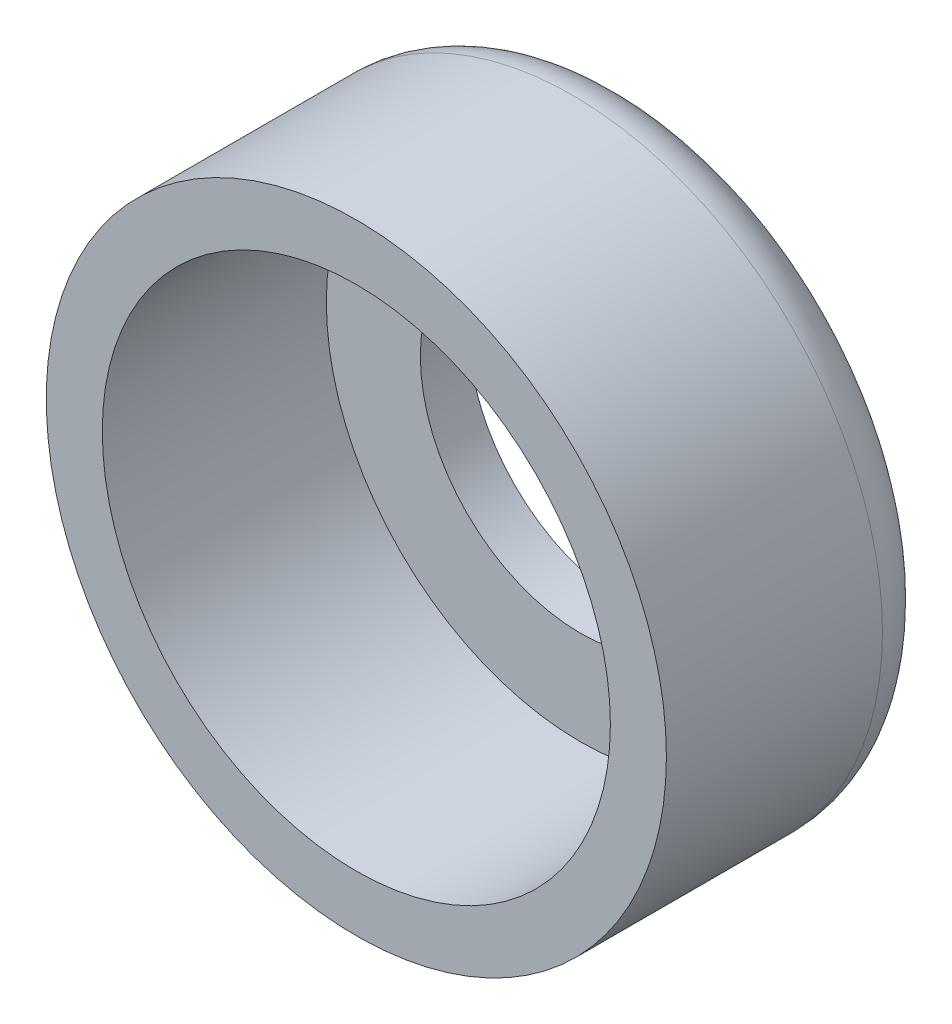
ISO-10303-21;
HEADER;
FILE_DESCRIPTION(('STEP AP214'),'2;1');
FILE_NAME('part.step','',(''),(''),'','','');
FILE_SCHEMA(('AUTOMOTIVE_DESIGN { 1 0 10303 214 1 1 1 1 }'));
ENDSEC;
DATA;
#1=APPLICATION_CONTEXT('core data for automotive mechanical design processes');
#2=APPLICATION_PROTOCOL_DEFINITION('international standard','automotive_design',2000,#1);
#3=PRODUCT_CONTEXT('',#1,'mechanical');
#4=PRODUCT('Part','Part','',(#3));
#5=PRODUCT_RELATED_PRODUCT_CATEGORY('part','',(#4));
#6=PRODUCT_DEFINITION_FORMATION('','',#4);
#7=PRODUCT_DEFINITION_CONTEXT('part definition',#1,'design');
#8=PRODUCT_DEFINITION('design','',#6,#7);
#9=PRODUCT_DEFINITION_SHAPE('','',#8);
#10=(LENGTH_UNIT() NAMED_UNIT(*) SI_UNIT(.MILLI.,.METRE.));
#11=(NAMED_UNIT(*) PLANE_ANGLE_UNIT() SI_UNIT($,.RADIAN.));
#12=(NAMED_UNIT(*) SI_UNIT($,.STERADIAN.) SOLID_ANGLE_UNIT());
#13=UNCERTAINTY_MEASURE_WITH_UNIT(LENGTH_MEASURE(1.E-05),#10,'distance_accuracy_value','');
#14=(GEOMETRIC_REPRESENTATION_CONTEXT(3) GLOBAL_UNCERTAINTY_ASSIGNED_CONTEXT((#13)) GLOBAL_UNIT_ASSIGNED_CONTEXT((#10,
#11,#12)) REPRESENTATION_CONTEXT('',''));
#15=CARTESIAN_POINT('',(0.,0.,0.));
#16=DIRECTION('',(0.,0.,1.));
#17=DIRECTION('',(1.,0.,0.));
#18=AXIS2_PLACEMENT_3D('',#15,#16,#17);
#19=CARTESIAN_POINT('',(0.,0.,0.6));
#20=DIRECTION('',(0.,0.,1.));
#21=DIRECTION('',(1.,0.,0.));
#22=AXIS2_PLACEMENT_3D('',#19,#20,#21);
#23=PLANE('',#22);
#24=CARTESIAN_POINT('',(0.,0.,0.6));
#25=DIRECTION('',(0.,0.,1.));
#26=DIRECTION('',(1.,0.,0.));
#27=AXIS2_PLACEMENT_3D('',#24,#25,#26);
#28=CIRCLE('',#27,2.);
#29=CARTESIAN_POINT('',(2.,0.,0.6));
#30=VERTEX_POINT('',#29);
#31=EDGE_CURVE('E62',#30,#30,#28,.T.);
#32=ORIENTED_EDGE('',*,*,#31,.F.);
#33=EDGE_LOOP('',(#32));
#34=FACE_BOUND('',#33,.T.);
#35=CARTESIAN_POINT('',(0.,0.,0.6));
#36=DIRECTION('',(0.,0.,1.));
#37=DIRECTION('',(1.,0.,0.));
#38=AXIS2_PLACEMENT_3D('',#35,#36,#37);
#39=CIRCLE('',#38,3.175);
#40=CARTESIAN_POINT('',(3.175,0.,0.6));
#41=VERTEX_POINT('',#40);
#42=EDGE_CURVE('E57',#41,#41,#39,.F.);
#43=ORIENTED_EDGE('',*,*,#42,.F.);
#44=EDGE_LOOP('',(#43));
#45=FACE_BOUND('',#44,.T.);
#46=ADVANCED_FACE('F43',(#34,#45),#23,.T.);
#47=CARTESIAN_POINT('',(0.,0.,0.));
#48=DIRECTION('',(0.,0.,1.));
#49=DIRECTION('',(1.,0.,0.));
#50=AXIS2_PLACEMENT_3D('',#47,#48,#49);
#51=PLANE('',#50);
#52=CARTESIAN_POINT('',(0.,0.,0.));
#53=DIRECTION('',(0.,0.,1.));
#54=DIRECTION('',(1.,0.,0.));
#55=AXIS2_PLACEMENT_3D('',#52,#53,#54);
#56=CIRCLE('',#55,3.175);
#57=CARTESIAN_POINT('',(3.175,0.,0.));
#58=VERTEX_POINT('',#57);
#59=EDGE_CURVE('E10',#58,#58,#56,.F.);
#60=ORIENTED_EDGE('',*,*,#59,.T.);
#61=EDGE_LOOP('',(#60));
#62=FACE_BOUND('',#61,.T.);
#63=CARTESIAN_POINT('',(0.,0.,0.));
#64=DIRECTION('',(0.,0.,1.));
#65=DIRECTION('',(1.,0.,0.));
#66=AXIS2_PLACEMENT_3D('',#63,#64,#65);
#67=CIRCLE('',#66,2.);
#68=CARTESIAN_POINT('',(2.,0.,0.));
#69=VERTEX_POINT('',#68);
#70=EDGE_CURVE('E61',#69,#69,#67,.T.);
#71=ORIENTED_EDGE('',*,*,#70,.T.);
#72=EDGE_LOOP('',(#71));
#73=FACE_BOUND('',#72,.T.);
#74=ADVANCED_FACE('F97',(#62,#73),#51,.F.);
#75=CARTESIAN_POINT('',(0.,0.,0.6));
#76=DIRECTION('',(0.,0.,-1.));
#77=DIRECTION('',(-1.,0.,0.));
#78=AXIS2_PLACEMENT_3D('',#75,#76,#77);
#79=CYLINDRICAL_SURFACE('',#78,3.875);
#80=CARTESIAN_POINT('',(0.,0.,0.7));
#81=DIRECTION('',(0.,0.,1.));
#82=DIRECTION('',(1.,0.,0.));
#83=AXIS2_PLACEMENT_3D('',#80,#81,#82);
#84=CIRCLE('',#83,3.875);
#85=CARTESIAN_POINT('',(3.875,0.,0.7));
#86=VERTEX_POINT('',#85);
#87=EDGE_CURVE('E51',#86,#86,#84,.T.);
#88=ORIENTED_EDGE('',*,*,#87,.T.);
#89=EDGE_LOOP('',(#88));
#90=FACE_BOUND('',#89,.T.);
#91=CARTESIAN_POINT('',(0.,0.,3.4));
#92=DIRECTION('',(0.,0.,1.));
#93=DIRECTION('',(1.,0.,0.));
#94=AXIS2_PLACEMENT_3D('',#91,#92,#93);
#95=CIRCLE('',#94,3.875);
#96=CARTESIAN_POINT('',(3.875,0.,3.4));
#97=VERTEX_POINT('',#96);
#98=EDGE_CURVE('E69',#97,#97,#95,.T.);
#99=ORIENTED_EDGE('',*,*,#98,.F.);
#100=EDGE_LOOP('',(#99));
#101=FACE_BOUND('',#100,.T.);
#102=ADVANCED_FACE('F95',(#90,#101),#79,.T.);
#103=CARTESIAN_POINT('',(0.,0.,0.6));
#104=DIRECTION('',(0.,0.,-1.));
#105=DIRECTION('',(-1.,0.,0.));
#106=AXIS2_PLACEMENT_3D('',#103,#104,#105);
#107=CYLINDRICAL_SURFACE('',#106,2.);
#108=ORIENTED_EDGE('',*,*,#31,.T.);
#109=EDGE_LOOP('',(#108));
#110=FACE_BOUND('',#109,.T.);
#111=ORIENTED_EDGE('',*,*,#70,.F.);
#112=EDGE_LOOP('',(#111));
#113=FACE_BOUND('',#112,.T.);
#114=ADVANCED_FACE('F83',(#110,#113),#107,.F.);
#115=CARTESIAN_POINT('',(0.,0.,3.4));
#116=DIRECTION('',(0.,0.,1.));
#117=DIRECTION('',(1.,0.,0.));
#118=AXIS2_PLACEMENT_3D('',#115,#116,#117);
#119=PLANE('',#118);
#120=ORIENTED_EDGE('',*,*,#98,.T.);
#121=EDGE_LOOP('',(#120));
#122=FACE_BOUND('',#121,.T.);
#123=CARTESIAN_POINT('',(0.,0.,3.4));
#124=DIRECTION('',(0.,0.,1.));
#125=DIRECTION('',(1.,0.,0.));
#126=AXIS2_PLACEMENT_3D('',#123,#124,#125);
#127=CIRCLE('',#126,3.175);
#128=CARTESIAN_POINT('',(3.175,0.,3.4));
#129=VERTEX_POINT('',#128);
#130=EDGE_CURVE('E71',#129,#129,#127,.T.);
#131=ORIENTED_EDGE('',*,*,#130,.F.);
#132=EDGE_LOOP('',(#131));
#133=FACE_BOUND('',#132,.T.);
#134=ADVANCED_FACE('F84',(#122,#133),#119,.T.);
#135=CARTESIAN_POINT('',(0.,0.,3.4));
#136=DIRECTION('',(0.,0.,-1.));
#137=DIRECTION('',(-1.,0.,0.));
#138=AXIS2_PLACEMENT_3D('',#135,#136,#137);
#139=CYLINDRICAL_SURFACE('',#138,3.175);
#140=ORIENTED_EDGE('',*,*,#130,.T.);
#141=EDGE_LOOP('',(#140));
#142=FACE_BOUND('',#141,.T.);
#143=ORIENTED_EDGE('',*,*,#42,.T.);
#144=EDGE_LOOP('',(#143));
#145=FACE_BOUND('',#144,.T.);
#146=ADVANCED_FACE('F78',(#142,#145),#139,.F.);
#147=CARTESIAN_POINT('',(0.,0.,0.7));
#148=DIRECTION('',(0.,0.,1.));
#149=DIRECTION('',(1.,0.,0.));
#150=AXIS2_PLACEMENT_3D('',#147,#148,#149);
#151=TOROIDAL_SURFACE('',#150,3.175,0.7);
#152=ORIENTED_EDGE('',*,*,#59,.F.);
#153=EDGE_LOOP('',(#152));
#154=FACE_BOUND('',#153,.T.);
#155=ORIENTED_EDGE('',*,*,#87,.F.);
#156=EDGE_LOOP('',(#155));
#157=FACE_BOUND('',#156,.T.);
#158=ADVANCED_FACE('F44',(#154,#157),#151,.T.);
#159=CLOSED_SHELL('',(#46,#74,#102,#114,#134,#146,#158));
#160=MANIFOLD_SOLID_BREP('B2',#159);
#161=ADVANCED_BREP_SHAPE_REPRESENTATION('',(#18,#160),#14);
#162=SHAPE_DEFINITION_REPRESENTATION(#9,#161);
ENDSEC;
END-ISO-10303-21;
